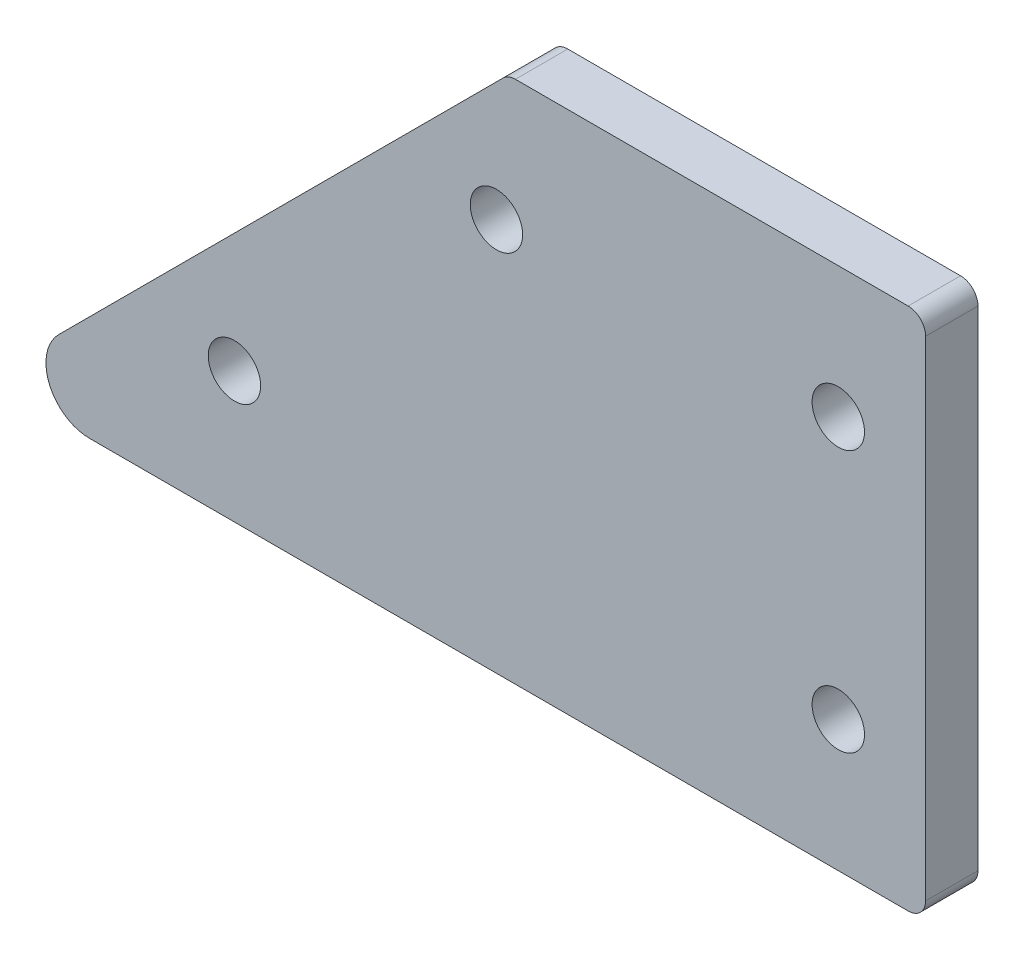
ISO-10303-21;
HEADER;
FILE_DESCRIPTION(('STEP AP214'),'2;1');
FILE_NAME('part.step','',(''),(''),'','','');
FILE_SCHEMA(('AUTOMOTIVE_DESIGN { 1 0 10303 214 1 1 1 1 }'));
ENDSEC;
DATA;
#1=APPLICATION_CONTEXT('core data for automotive mechanical design processes');
#2=APPLICATION_PROTOCOL_DEFINITION('international standard','automotive_design',2000,#1);
#3=PRODUCT_CONTEXT('',#1,'mechanical');
#4=PRODUCT('Part','Part','',(#3));
#5=PRODUCT_RELATED_PRODUCT_CATEGORY('part','',(#4));
#6=PRODUCT_DEFINITION_FORMATION('','',#4);
#7=PRODUCT_DEFINITION_CONTEXT('part definition',#1,'design');
#8=PRODUCT_DEFINITION('design','',#6,#7);
#9=PRODUCT_DEFINITION_SHAPE('','',#8);
#10=(LENGTH_UNIT() NAMED_UNIT(*) SI_UNIT(.MILLI.,.METRE.));
#11=(NAMED_UNIT(*) PLANE_ANGLE_UNIT() SI_UNIT($,.RADIAN.));
#12=(NAMED_UNIT(*) SI_UNIT($,.STERADIAN.) SOLID_ANGLE_UNIT());
#13=UNCERTAINTY_MEASURE_WITH_UNIT(LENGTH_MEASURE(1.E-05),#10,'distance_accuracy_value','');
#14=(GEOMETRIC_REPRESENTATION_CONTEXT(3) GLOBAL_UNCERTAINTY_ASSIGNED_CONTEXT((#13)) GLOBAL_UNIT_ASSIGNED_CONTEXT((#10,
#11,#12)) REPRESENTATION_CONTEXT('',''));
#15=CARTESIAN_POINT('',(0.,0.,0.));
#16=DIRECTION('',(0.,0.,1.));
#17=DIRECTION('',(1.,0.,0.));
#18=AXIS2_PLACEMENT_3D('',#15,#16,#17);
#19=CARTESIAN_POINT('',(-95.7369321881345,5.,0.));
#20=DIRECTION('',(0.,0.,1.));
#21=DIRECTION('',(-0.70710678118655,0.707106781186546,0.));
#22=AXIS2_PLACEMENT_3D('',#19,#20,#21);
#23=CYLINDRICAL_SURFACE('',#22,5.);
#24=DIRECTION('',(0.,0.,1.));
#25=VECTOR('',#24,1.);
#26=CARTESIAN_POINT('',(-95.7369321881345,0.,0.));
#27=LINE('',#26,#25);
#28=CARTESIAN_POINT('',(-95.7369321881345,0.,-4.));
#29=VERTEX_POINT('',#28);
#30=CARTESIAN_POINT('',(-95.7369321881345,0.,2.));
#31=VERTEX_POINT('',#30);
#32=EDGE_CURVE('E11',#29,#31,#27,.T.);
#33=ORIENTED_EDGE('',*,*,#32,.T.);
#34=CARTESIAN_POINT('',(-95.7369321881345,5.,2.));
#35=DIRECTION('',(0.,0.,1.));
#36=DIRECTION('',(-0.70710678118655,0.707106781186546,0.));
#37=AXIS2_PLACEMENT_3D('',#34,#35,#36);
#38=CIRCLE('',#37,5.);
#39=CARTESIAN_POINT('',(-99.2724660940673,8.53553390593275,2.));
#40=VERTEX_POINT('',#39);
#41=EDGE_CURVE('E24',#40,#31,#38,.T.);
#42=ORIENTED_EDGE('',*,*,#41,.F.);
#43=DIRECTION('',(0.,0.,-1.));
#44=VECTOR('',#43,1.);
#45=CARTESIAN_POINT('',(-99.2724660940673,8.53553390593275,0.));
#46=LINE('',#45,#44);
#47=CARTESIAN_POINT('',(-99.2724660940673,8.53553390593275,-4.));
#48=VERTEX_POINT('',#47);
#49=EDGE_CURVE('E188',#40,#48,#46,.T.);
#50=ORIENTED_EDGE('',*,*,#49,.T.);
#51=CARTESIAN_POINT('',(-95.7369321881345,5.,-4.));
#52=DIRECTION('',(0.,0.,-1.));
#53=DIRECTION('',(-0.70710678118655,0.707106781186546,0.));
#54=AXIS2_PLACEMENT_3D('',#51,#52,#53);
#55=CIRCLE('',#54,5.);
#56=EDGE_CURVE('E101',#29,#48,#55,.T.);
#57=ORIENTED_EDGE('',*,*,#56,.F.);
#58=EDGE_LOOP('',(#33,#42,#50,#57));
#59=FACE_BOUND('',#58,.T.);
#60=ADVANCED_FACE('F16',(#59),#23,.T.);
#61=CARTESIAN_POINT('',(-95.7369321881345,0.,0.));
#62=DIRECTION('',(0.,-1.,0.));
#63=DIRECTION('',(1.,0.,0.));
#64=AXIS2_PLACEMENT_3D('',#61,#62,#63);
#65=PLANE('',#64);
#66=DIRECTION('',(0.,0.,1.));
#67=VECTOR('',#66,1.);
#68=CARTESIAN_POINT('',(-2.,0.,0.));
#69=LINE('',#68,#67);
#70=CARTESIAN_POINT('',(-2.,0.,-4.));
#71=VERTEX_POINT('',#70);
#72=CARTESIAN_POINT('',(-2.,0.,2.));
#73=VERTEX_POINT('',#72);
#74=EDGE_CURVE('E181',#71,#73,#69,.T.);
#75=ORIENTED_EDGE('',*,*,#74,.T.);
#76=DIRECTION('',(1.,0.,0.));
#77=VECTOR('',#76,1.);
#78=CARTESIAN_POINT('',(-2.,0.,2.));
#79=LINE('',#78,#77);
#80=EDGE_CURVE('E176',#31,#73,#79,.T.);
#81=ORIENTED_EDGE('',*,*,#80,.F.);
#82=ORIENTED_EDGE('',*,*,#32,.F.);
#83=DIRECTION('',(-1.,0.,0.));
#84=VECTOR('',#83,1.);
#85=CARTESIAN_POINT('',(-2.,0.,-4.));
#86=LINE('',#85,#84);
#87=EDGE_CURVE('E172',#71,#29,#86,.T.);
#88=ORIENTED_EDGE('',*,*,#87,.F.);
#89=EDGE_LOOP('',(#75,#81,#82,#88));
#90=FACE_BOUND('',#89,.T.);
#91=ADVANCED_FACE('F215',(#90),#65,.T.);
#92=CARTESIAN_POINT('',(-2.,2.,0.));
#93=DIRECTION('',(0.,0.,1.));
#94=DIRECTION('',(0.,-1.,0.));
#95=AXIS2_PLACEMENT_3D('',#92,#93,#94);
#96=CYLINDRICAL_SURFACE('',#95,2.);
#97=DIRECTION('',(0.,0.,1.));
#98=VECTOR('',#97,1.);
#99=CARTESIAN_POINT('',(0.,2.,0.));
#100=LINE('',#99,#98);
#101=CARTESIAN_POINT('',(0.,2.,-4.));
#102=VERTEX_POINT('',#101);
#103=CARTESIAN_POINT('',(0.,2.,2.));
#104=VERTEX_POINT('',#103);
#105=EDGE_CURVE('E168',#102,#104,#100,.T.);
#106=ORIENTED_EDGE('',*,*,#105,.T.);
#107=CARTESIAN_POINT('',(-2.,2.,2.));
#108=DIRECTION('',(0.,0.,1.));
#109=DIRECTION('',(0.,-1.,0.));
#110=AXIS2_PLACEMENT_3D('',#107,#108,#109);
#111=CIRCLE('',#110,2.);
#112=EDGE_CURVE('E163',#73,#104,#111,.T.);
#113=ORIENTED_EDGE('',*,*,#112,.F.);
#114=ORIENTED_EDGE('',*,*,#74,.F.);
#115=CARTESIAN_POINT('',(-2.,2.,-4.));
#116=DIRECTION('',(0.,0.,-1.));
#117=DIRECTION('',(0.,-1.,0.));
#118=AXIS2_PLACEMENT_3D('',#115,#116,#117);
#119=CIRCLE('',#118,2.);
#120=EDGE_CURVE('E158',#102,#71,#119,.T.);
#121=ORIENTED_EDGE('',*,*,#120,.F.);
#122=EDGE_LOOP('',(#106,#113,#114,#121));
#123=FACE_BOUND('',#122,.T.);
#124=ADVANCED_FACE('F212',(#123),#96,.T.);
#125=CARTESIAN_POINT('',(0.,2.,0.));
#126=DIRECTION('',(1.,0.,0.));
#127=DIRECTION('',(0.,1.,0.));
#128=AXIS2_PLACEMENT_3D('',#125,#126,#127);
#129=PLANE('',#128);
#130=DIRECTION('',(0.,0.,1.));
#131=VECTOR('',#130,1.);
#132=CARTESIAN_POINT('',(0.,58.,0.));
#133=LINE('',#132,#131);
#134=CARTESIAN_POINT('',(0.,58.,-4.));
#135=VERTEX_POINT('',#134);
#136=CARTESIAN_POINT('',(0.,58.,2.));
#137=VERTEX_POINT('',#136);
#138=EDGE_CURVE('E154',#135,#137,#133,.T.);
#139=ORIENTED_EDGE('',*,*,#138,.T.);
#140=DIRECTION('',(0.,1.,0.));
#141=VECTOR('',#140,1.);
#142=CARTESIAN_POINT('',(0.,2.,2.));
#143=LINE('',#142,#141);
#144=EDGE_CURVE('E149',#104,#137,#143,.T.);
#145=ORIENTED_EDGE('',*,*,#144,.F.);
#146=ORIENTED_EDGE('',*,*,#105,.F.);
#147=DIRECTION('',(0.,-1.,0.));
#148=VECTOR('',#147,1.);
#149=CARTESIAN_POINT('',(0.,2.,-4.));
#150=LINE('',#149,#148);
#151=EDGE_CURVE('E144',#135,#102,#150,.T.);
#152=ORIENTED_EDGE('',*,*,#151,.F.);
#153=EDGE_LOOP('',(#139,#145,#146,#152));
#154=FACE_BOUND('',#153,.T.);
#155=ADVANCED_FACE('F208',(#154),#129,.T.);
#156=CARTESIAN_POINT('',(-2.,58.,0.));
#157=DIRECTION('',(0.,0.,1.));
#158=DIRECTION('',(1.,0.,0.));
#159=AXIS2_PLACEMENT_3D('',#156,#157,#158);
#160=CYLINDRICAL_SURFACE('',#159,2.);
#161=DIRECTION('',(0.,0.,1.));
#162=VECTOR('',#161,1.);
#163=CARTESIAN_POINT('',(-2.,60.,0.));
#164=LINE('',#163,#162);
#165=CARTESIAN_POINT('',(-2.,60.,-4.));
#166=VERTEX_POINT('',#165);
#167=CARTESIAN_POINT('',(-2.,60.,2.));
#168=VERTEX_POINT('',#167);
#169=EDGE_CURVE('E140',#166,#168,#164,.T.);
#170=ORIENTED_EDGE('',*,*,#169,.T.);
#171=CARTESIAN_POINT('',(-2.,58.,2.));
#172=DIRECTION('',(0.,0.,1.));
#173=DIRECTION('',(1.,0.,0.));
#174=AXIS2_PLACEMENT_3D('',#171,#172,#173);
#175=CIRCLE('',#174,2.);
#176=EDGE_CURVE('E135',#137,#168,#175,.T.);
#177=ORIENTED_EDGE('',*,*,#176,.F.);
#178=ORIENTED_EDGE('',*,*,#138,.F.);
#179=CARTESIAN_POINT('',(-2.,58.,-4.));
#180=DIRECTION('',(0.,0.,-1.));
#181=DIRECTION('',(1.,0.,0.));
#182=AXIS2_PLACEMENT_3D('',#179,#180,#181);
#183=CIRCLE('',#182,2.);
#184=EDGE_CURVE('E130',#166,#135,#183,.T.);
#185=ORIENTED_EDGE('',*,*,#184,.F.);
#186=EDGE_LOOP('',(#170,#177,#178,#185));
#187=FACE_BOUND('',#186,.T.);
#188=ADVANCED_FACE('F205',(#187),#160,.T.);
#189=CARTESIAN_POINT('',(-2.,60.,0.));
#190=DIRECTION('',(0.,1.,0.));
#191=DIRECTION('',(-1.,0.,0.));
#192=AXIS2_PLACEMENT_3D('',#189,#190,#191);
#193=PLANE('',#192);
#194=DIRECTION('',(0.,0.,1.));
#195=VECTOR('',#194,1.);
#196=CARTESIAN_POINT('',(-46.9795728752538,60.,0.));
#197=LINE('',#196,#195);
#198=CARTESIAN_POINT('',(-46.9795728752538,60.,-4.));
#199=VERTEX_POINT('',#198);
#200=CARTESIAN_POINT('',(-46.9795728752538,60.,2.));
#201=VERTEX_POINT('',#200);
#202=EDGE_CURVE('E83',#199,#201,#197,.T.);
#203=ORIENTED_EDGE('',*,*,#202,.T.);
#204=DIRECTION('',(-1.,0.,0.));
#205=VECTOR('',#204,1.);
#206=CARTESIAN_POINT('',(-2.,60.,2.));
#207=LINE('',#206,#205);
#208=EDGE_CURVE('E122',#168,#201,#207,.T.);
#209=ORIENTED_EDGE('',*,*,#208,.F.);
#210=ORIENTED_EDGE('',*,*,#169,.F.);
#211=DIRECTION('',(1.,0.,0.));
#212=VECTOR('',#211,1.);
#213=CARTESIAN_POINT('',(-2.,60.,-4.));
#214=LINE('',#213,#212);
#215=EDGE_CURVE('E97',#199,#166,#214,.T.);
#216=ORIENTED_EDGE('',*,*,#215,.F.);
#217=EDGE_LOOP('',(#203,#209,#210,#216));
#218=FACE_BOUND('',#217,.T.);
#219=ADVANCED_FACE('F202',(#218),#193,.T.);
#220=CARTESIAN_POINT('',(-46.9795728752538,58.,0.));
#221=DIRECTION('',(0.,0.,1.));
#222=DIRECTION('',(0.,1.,0.));
#223=AXIS2_PLACEMENT_3D('',#220,#221,#222);
#224=CYLINDRICAL_SURFACE('',#223,2.);
#225=DIRECTION('',(0.,0.,1.));
#226=VECTOR('',#225,1.);
#227=CARTESIAN_POINT('',(-48.3937864376269,59.4142135623731,0.));
#228=LINE('',#227,#226);
#229=CARTESIAN_POINT('',(-48.3937864376269,59.4142135623731,-4.));
#230=VERTEX_POINT('',#229);
#231=CARTESIAN_POINT('',(-48.3937864376269,59.4142135623731,2.));
#232=VERTEX_POINT('',#231);
#233=EDGE_CURVE('E81',#230,#232,#228,.T.);
#234=ORIENTED_EDGE('',*,*,#233,.T.);
#235=CARTESIAN_POINT('',(-46.9795728752538,58.,2.));
#236=DIRECTION('',(0.,0.,1.));
#237=DIRECTION('',(0.,1.,0.));
#238=AXIS2_PLACEMENT_3D('',#235,#236,#237);
#239=CIRCLE('',#238,2.);
#240=EDGE_CURVE('E87',#201,#232,#239,.T.);
#241=ORIENTED_EDGE('',*,*,#240,.F.);
#242=ORIENTED_EDGE('',*,*,#202,.F.);
#243=CARTESIAN_POINT('',(-46.9795728752538,58.,-4.));
#244=DIRECTION('',(0.,0.,-1.));
#245=DIRECTION('',(0.,1.,0.));
#246=AXIS2_PLACEMENT_3D('',#243,#244,#245);
#247=CIRCLE('',#246,2.);
#248=EDGE_CURVE('E77',#230,#199,#247,.T.);
#249=ORIENTED_EDGE('',*,*,#248,.F.);
#250=EDGE_LOOP('',(#234,#241,#242,#249));
#251=FACE_BOUND('',#250,.T.);
#252=ADVANCED_FACE('F79',(#251),#224,.T.);
#253=CARTESIAN_POINT('',(-48.3937864376269,59.4142135623731,0.));
#254=DIRECTION('',(-0.707106781186547,0.707106781186548,0.));
#255=DIRECTION('',(-0.707106781186548,-0.707106781186547,0.));
#256=AXIS2_PLACEMENT_3D('',#253,#254,#255);
#257=PLANE('',#256);
#258=ORIENTED_EDGE('',*,*,#49,.F.);
#259=DIRECTION('',(-0.707106781186548,-0.707106781186547,0.));
#260=VECTOR('',#259,1.);
#261=CARTESIAN_POINT('',(-99.2724660940673,8.53553390593275,2.));
#262=LINE('',#261,#260);
#263=EDGE_CURVE('E88',#232,#40,#262,.T.);
#264=ORIENTED_EDGE('',*,*,#263,.F.);
#265=ORIENTED_EDGE('',*,*,#233,.F.);
#266=DIRECTION('',(0.707106781186548,0.707106781186547,0.));
#267=VECTOR('',#266,1.);
#268=CARTESIAN_POINT('',(-99.2724660940673,8.53553390593275,-4.));
#269=LINE('',#268,#267);
#270=EDGE_CURVE('E93',#48,#230,#269,.T.);
#271=ORIENTED_EDGE('',*,*,#270,.F.);
#272=EDGE_LOOP('',(#258,#264,#265,#271));
#273=FACE_BOUND('',#272,.T.);
#274=ADVANCED_FACE('F92',(#273),#257,.T.);
#275=CARTESIAN_POINT('',(-79.15,15.,0.));
#276=DIRECTION('',(0.,0.,1.));
#277=DIRECTION('',(1.,0.,0.));
#278=AXIS2_PLACEMENT_3D('',#275,#276,#277);
#279=CYLINDRICAL_SURFACE('',#278,3.);
#280=CARTESIAN_POINT('',(-79.15,15.,-4.));
#281=DIRECTION('',(0.,0.,1.));
#282=DIRECTION('',(1.,0.,0.));
#283=AXIS2_PLACEMENT_3D('',#280,#281,#282);
#284=CIRCLE('',#283,3.);
#285=CARTESIAN_POINT('',(-76.15,15.,-4.));
#286=VERTEX_POINT('',#285);
#287=EDGE_CURVE('E102',#286,#286,#284,.T.);
#288=ORIENTED_EDGE('',*,*,#287,.F.);
#289=EDGE_LOOP('',(#288));
#290=FACE_BOUND('',#289,.T.);
#291=CARTESIAN_POINT('',(-79.15,15.,2.));
#292=DIRECTION('',(0.,0.,-1.));
#293=DIRECTION('',(1.,0.,0.));
#294=AXIS2_PLACEMENT_3D('',#291,#292,#293);
#295=CIRCLE('',#294,3.);
#296=CARTESIAN_POINT('',(-76.15,15.,2.));
#297=VERTEX_POINT('',#296);
#298=EDGE_CURVE('E106',#297,#297,#295,.T.);
#299=ORIENTED_EDGE('',*,*,#298,.F.);
#300=EDGE_LOOP('',(#299));
#301=FACE_BOUND('',#300,.T.);
#302=ADVANCED_FACE('F234',(#290,#301),#279,.F.);
#303=CARTESIAN_POINT('',(-10.,15.,0.));
#304=DIRECTION('',(0.,0.,1.));
#305=DIRECTION('',(1.,0.,0.));
#306=AXIS2_PLACEMENT_3D('',#303,#304,#305);
#307=CYLINDRICAL_SURFACE('',#306,3.);
#308=CARTESIAN_POINT('',(-10.,15.,-4.));
#309=DIRECTION('',(0.,0.,1.));
#310=DIRECTION('',(1.,0.,0.));
#311=AXIS2_PLACEMENT_3D('',#308,#309,#310);
#312=CIRCLE('',#311,3.);
#313=CARTESIAN_POINT('',(-7.,15.,-4.));
#314=VERTEX_POINT('',#313);
#315=EDGE_CURVE('E268',#314,#314,#312,.T.);
#316=ORIENTED_EDGE('',*,*,#315,.F.);
#317=EDGE_LOOP('',(#316));
#318=FACE_BOUND('',#317,.T.);
#319=CARTESIAN_POINT('',(-10.,15.,2.));
#320=DIRECTION('',(0.,0.,-1.));
#321=DIRECTION('',(1.,0.,0.));
#322=AXIS2_PLACEMENT_3D('',#319,#320,#321);
#323=CIRCLE('',#322,3.);
#324=CARTESIAN_POINT('',(-7.,15.,2.));
#325=VERTEX_POINT('',#324);
#326=EDGE_CURVE('E274',#325,#325,#323,.T.);
#327=ORIENTED_EDGE('',*,*,#326,.F.);
#328=EDGE_LOOP('',(#327));
#329=FACE_BOUND('',#328,.T.);
#330=ADVANCED_FACE('F237',(#318,#329),#307,.F.);
#331=CARTESIAN_POINT('',(-10.,45.,0.));
#332=DIRECTION('',(0.,0.,1.));
#333=DIRECTION('',(1.,0.,0.));
#334=AXIS2_PLACEMENT_3D('',#331,#332,#333);
#335=CYLINDRICAL_SURFACE('',#334,3.);
#336=CARTESIAN_POINT('',(-10.,45.,-4.));
#337=DIRECTION('',(0.,0.,1.));
#338=DIRECTION('',(1.,0.,0.));
#339=AXIS2_PLACEMENT_3D('',#336,#337,#338);
#340=CIRCLE('',#339,3.);
#341=CARTESIAN_POINT('',(-7.,45.,-4.));
#342=VERTEX_POINT('',#341);
#343=EDGE_CURVE('E264',#342,#342,#340,.T.);
#344=ORIENTED_EDGE('',*,*,#343,.F.);
#345=EDGE_LOOP('',(#344));
#346=FACE_BOUND('',#345,.T.);
#347=CARTESIAN_POINT('',(-10.,45.,2.));
#348=DIRECTION('',(0.,0.,-1.));
#349=DIRECTION('',(1.,0.,0.));
#350=AXIS2_PLACEMENT_3D('',#347,#348,#349);
#351=CIRCLE('',#350,3.);
#352=CARTESIAN_POINT('',(-7.,45.,2.));
#353=VERTEX_POINT('',#352);
#354=EDGE_CURVE('E280',#353,#353,#351,.T.);
#355=ORIENTED_EDGE('',*,*,#354,.F.);
#356=EDGE_LOOP('',(#355));
#357=FACE_BOUND('',#356,.T.);
#358=ADVANCED_FACE('F241',(#346,#357),#335,.F.);
#359=CARTESIAN_POINT('',(-49.15,45.,0.));
#360=DIRECTION('',(0.,0.,1.));
#361=DIRECTION('',(1.,0.,0.));
#362=AXIS2_PLACEMENT_3D('',#359,#360,#361);
#363=CYLINDRICAL_SURFACE('',#362,3.);
#364=CARTESIAN_POINT('',(-49.15,45.,-4.));
#365=DIRECTION('',(0.,0.,1.));
#366=DIRECTION('',(1.,0.,0.));
#367=AXIS2_PLACEMENT_3D('',#364,#365,#366);
#368=CIRCLE('',#367,3.);
#369=CARTESIAN_POINT('',(-46.15,45.,-4.));
#370=VERTEX_POINT('',#369);
#371=EDGE_CURVE('E260',#370,#370,#368,.T.);
#372=ORIENTED_EDGE('',*,*,#371,.F.);
#373=EDGE_LOOP('',(#372));
#374=FACE_BOUND('',#373,.T.);
#375=CARTESIAN_POINT('',(-49.15,45.,2.));
#376=DIRECTION('',(0.,0.,-1.));
#377=DIRECTION('',(1.,0.,0.));
#378=AXIS2_PLACEMENT_3D('',#375,#376,#377);
#379=CIRCLE('',#378,3.);
#380=CARTESIAN_POINT('',(-46.15,45.,2.));
#381=VERTEX_POINT('',#380);
#382=EDGE_CURVE('E284',#381,#381,#379,.T.);
#383=ORIENTED_EDGE('',*,*,#382,.F.);
#384=EDGE_LOOP('',(#383));
#385=FACE_BOUND('',#384,.T.);
#386=ADVANCED_FACE('F245',(#374,#385),#363,.F.);
#387=CARTESIAN_POINT('',(-50.3684660940673,30.,2.));
#388=DIRECTION('',(0.,0.,1.));
#389=DIRECTION('',(1.,0.,0.));
#390=AXIS2_PLACEMENT_3D('',#387,#388,#389);
#391=PLANE('',#390);
#392=ORIENTED_EDGE('',*,*,#382,.T.);
#393=EDGE_LOOP('',(#392));
#394=FACE_BOUND('',#393,.T.);
#395=ORIENTED_EDGE('',*,*,#354,.T.);
#396=EDGE_LOOP('',(#395));
#397=FACE_BOUND('',#396,.T.);
#398=ORIENTED_EDGE('',*,*,#326,.T.);
#399=EDGE_LOOP('',(#398));
#400=FACE_BOUND('',#399,.T.);
#401=ORIENTED_EDGE('',*,*,#298,.T.);
#402=EDGE_LOOP('',(#401));
#403=FACE_BOUND('',#402,.T.);
#404=ORIENTED_EDGE('',*,*,#41,.T.);
#405=ORIENTED_EDGE('',*,*,#80,.T.);
#406=ORIENTED_EDGE('',*,*,#112,.T.);
#407=ORIENTED_EDGE('',*,*,#144,.T.);
#408=ORIENTED_EDGE('',*,*,#176,.T.);
#409=ORIENTED_EDGE('',*,*,#208,.T.);
#410=ORIENTED_EDGE('',*,*,#240,.T.);
#411=ORIENTED_EDGE('',*,*,#263,.T.);
#412=EDGE_LOOP('',(#404,#405,#406,#407,#408,#409,#410,#411));
#413=FACE_BOUND('',#412,.T.);
#414=ADVANCED_FACE('F197',(#394,#397,#400,#403,#413),#391,.T.);
#415=CARTESIAN_POINT('',(-50.3684660940673,30.,-4.));
#416=DIRECTION('',(0.,0.,1.));
#417=DIRECTION('',(1.,0.,0.));
#418=AXIS2_PLACEMENT_3D('',#415,#416,#417);
#419=PLANE('',#418);
#420=ORIENTED_EDGE('',*,*,#371,.T.);
#421=EDGE_LOOP('',(#420));
#422=FACE_BOUND('',#421,.T.);
#423=ORIENTED_EDGE('',*,*,#343,.T.);
#424=EDGE_LOOP('',(#423));
#425=FACE_BOUND('',#424,.T.);
#426=ORIENTED_EDGE('',*,*,#315,.T.);
#427=EDGE_LOOP('',(#426));
#428=FACE_BOUND('',#427,.T.);
#429=ORIENTED_EDGE('',*,*,#287,.T.);
#430=EDGE_LOOP('',(#429));
#431=FACE_BOUND('',#430,.T.);
#432=ORIENTED_EDGE('',*,*,#56,.T.);
#433=ORIENTED_EDGE('',*,*,#270,.T.);
#434=ORIENTED_EDGE('',*,*,#248,.T.);
#435=ORIENTED_EDGE('',*,*,#215,.T.);
#436=ORIENTED_EDGE('',*,*,#184,.T.);
#437=ORIENTED_EDGE('',*,*,#151,.T.);
#438=ORIENTED_EDGE('',*,*,#120,.T.);
#439=ORIENTED_EDGE('',*,*,#87,.T.);
#440=EDGE_LOOP('',(#432,#433,#434,#435,#436,#437,#438,#439));
#441=FACE_BOUND('',#440,.T.);
#442=ADVANCED_FACE('F99',(#422,#425,#428,#431,#441),#419,.F.);
#443=CLOSED_SHELL('',(#60,#91,#124,#155,#188,#219,#252,#274,#302,#330,#358,#386,#414,#442));
#444=MANIFOLD_SOLID_BREP('B1',#443);
#445=ADVANCED_BREP_SHAPE_REPRESENTATION('',(#18,#444),#14);
#446=SHAPE_DEFINITION_REPRESENTATION(#9,#445);
ENDSEC;
END-ISO-10303-21;
